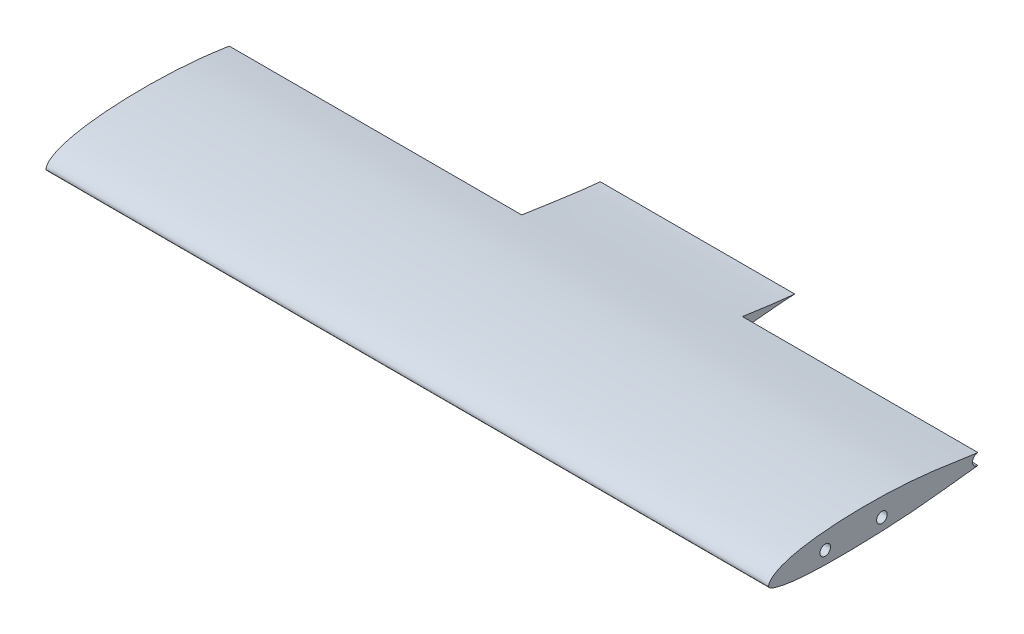
ISO-10303-21;
HEADER;
FILE_DESCRIPTION(('STEP AP214'),'2;1');
FILE_NAME('part.step','',(''),(''),'','','');
FILE_SCHEMA(('AUTOMOTIVE_DESIGN { 1 0 10303 214 1 1 1 1 }'));
ENDSEC;
DATA;
#1=APPLICATION_CONTEXT('core data for automotive mechanical design processes');
#2=APPLICATION_PROTOCOL_DEFINITION('international standard','automotive_design',2000,#1);
#3=PRODUCT_CONTEXT('',#1,'mechanical');
#4=PRODUCT('Part','Part','',(#3));
#5=PRODUCT_RELATED_PRODUCT_CATEGORY('part','',(#4));
#6=PRODUCT_DEFINITION_FORMATION('','',#4);
#7=PRODUCT_DEFINITION_CONTEXT('part definition',#1,'design');
#8=PRODUCT_DEFINITION('design','',#6,#7);
#9=PRODUCT_DEFINITION_SHAPE('','',#8);
#10=(LENGTH_UNIT() NAMED_UNIT(*) SI_UNIT(.MILLI.,.METRE.));
#11=(NAMED_UNIT(*) PLANE_ANGLE_UNIT() SI_UNIT($,.RADIAN.));
#12=(NAMED_UNIT(*) SI_UNIT($,.STERADIAN.) SOLID_ANGLE_UNIT());
#13=UNCERTAINTY_MEASURE_WITH_UNIT(LENGTH_MEASURE(1.E-05),#10,'distance_accuracy_value','');
#14=(GEOMETRIC_REPRESENTATION_CONTEXT(3) GLOBAL_UNCERTAINTY_ASSIGNED_CONTEXT((#13)) GLOBAL_UNIT_ASSIGNED_CONTEXT((#10,
#11,#12)) REPRESENTATION_CONTEXT('',''));
#15=CARTESIAN_POINT('',(0.,0.,0.));
#16=DIRECTION('',(0.,0.,1.));
#17=DIRECTION('',(1.,0.,0.));
#18=AXIS2_PLACEMENT_3D('',#15,#16,#17);
#19=CARTESIAN_POINT('',(1040.,4.83997638769715,-346.6));
#20=CARTESIAN_POINT('',(1040.,4.84868294691011,-346.59785213397));
#21=CARTESIAN_POINT('',(1040.,4.93336209756162,-345.166936044504));
#22=CARTESIAN_POINT('',(1040.,5.10700694519278,-343.709836643677));
#23=CARTESIAN_POINT('',(1040.,5.41017075794042,-340.206784132033));
#24=CARTESIAN_POINT('',(1040.,5.85268281466644,-335.905943355972));
#25=CARTESIAN_POINT('',(1040.,6.4722745474185,-330.29031907157));
#26=CARTESIAN_POINT('',(1040.,7.25373437050042,-323.655847310548));
#27=CARTESIAN_POINT('',(1040.,8.22307664941785,-315.997567636551));
#28=CARTESIAN_POINT('',(1040.,9.36156097861068,-307.423222857254));
#29=CARTESIAN_POINT('',(1040.,10.6635037599335,-298.010831034326));
#30=CARTESIAN_POINT('',(1040.,12.1173159709685,-287.854212759161));
#31=CARTESIAN_POINT('',(1040.,13.6988944275419,-277.048408585074));
#32=CARTESIAN_POINT('',(1040.,15.3817883153086,-265.691695949232));
#33=CARTESIAN_POINT('',(1040.,17.1219228948068,-253.881119893573));
#34=CARTESIAN_POINT('',(1040.,18.9007690967919,-241.720308010265));
#35=CARTESIAN_POINT('',(1040.,20.638143833598,-229.308493852932));
#36=CARTESIAN_POINT('',(1040.,22.3157910551663,-216.741551687001));
#37=CARTESIAN_POINT('',(1040.,23.7595433863055,-204.050857632811));
#38=CARTESIAN_POINT('',(1040.,24.9053426433323,-191.257428920763));
#39=CARTESIAN_POINT('',(1040.,25.8572517006955,-178.398255103325));
#40=CARTESIAN_POINT('',(1040.,26.5782085447624,-165.519761570319));
#41=CARTESIAN_POINT('',(1040.,27.0713380866151,-152.694536507981));
#42=CARTESIAN_POINT('',(1040.,27.3617048782736,-139.989981786491));
#43=CARTESIAN_POINT('',(1040.,27.4214259489243,-127.474648660722));
#44=CARTESIAN_POINT('',(1040.,27.2786662067202,-115.21693666225));
#45=CARTESIAN_POINT('',(1040.,26.9174034340255,-103.283909878835));
#46=CARTESIAN_POINT('',(1040.,26.360201212197,-91.7466650302918));
#47=CARTESIAN_POINT('',(1040.,25.602562122874,-80.6691840019192));
#48=CARTESIAN_POINT('',(1040.,24.6662261613144,-70.1181532773865));
#49=CARTESIAN_POINT('',(1040.,23.5415922869784,-60.1571368746462));
#50=CARTESIAN_POINT('',(1040.,22.2483852151924,-50.843546419187));
#51=CARTESIAN_POINT('',(1040.,20.7681558316871,-42.2316784452521));
#52=CARTESIAN_POINT('',(1040.,19.1388977835948,-34.3615830461008));
#53=CARTESIAN_POINT('',(1040.,17.3170359072766,-27.2684076187504));
#54=CARTESIAN_POINT('',(1040.,15.3019620529912,-20.9780333205586));
#55=CARTESIAN_POINT('',(1040.,13.1824606631904,-15.4779938036206));
#56=CARTESIAN_POINT('',(1040.,10.9371691606662,-10.7994149202204));
#57=CARTESIAN_POINT('',(1040.,8.63337766346878,-6.95382679368364));
#58=CARTESIAN_POINT('',(1040.,6.30098718992494,-3.93591898079676));
#59=CARTESIAN_POINT('',(1040.,3.89645227401003,-1.76621965553461));
#60=CARTESIAN_POINT('',(1040.,1.5610546807599,-0.467529411694256));
#61=CARTESIAN_POINT('',(1040.,-0.611861653624535,0.289663119257988));
#62=CARTESIAN_POINT('',(1040.,-2.77906348855156,-0.370650439303011));
#63=CARTESIAN_POINT('',(1040.,-4.21995184765395,-2.48232441391583));
#64=CARTESIAN_POINT('',(1040.,-5.67727699514903,-5.33698465791971));
#65=CARTESIAN_POINT('',(1040.,-7.07739123288437,-9.25198377943141));
#66=CARTESIAN_POINT('',(1040.,-8.39823430199488,-14.1065752398985));
#67=CARTESIAN_POINT('',(1040.,-9.61516954449393,-19.9024318244629));
#68=CARTESIAN_POINT('',(1040.,-10.7010995656754,-26.599345669982));
#69=CARTESIAN_POINT('',(1040.,-11.6537912755739,-34.1645195713889));
#70=CARTESIAN_POINT('',(1040.,-12.4597704216329,-42.5604388567903));
#71=CARTESIAN_POINT('',(1040.,-13.1153519549816,-51.7390191835686));
#72=CARTESIAN_POINT('',(1040.,-13.6251626516985,-61.6504552794448));
#73=CARTESIAN_POINT('',(1040.,-13.9816658713143,-72.2364850835678));
#74=CARTESIAN_POINT('',(1040.,-14.1886964665776,-83.4369290290459));
#75=CARTESIAN_POINT('',(1040.,-14.2450062649441,-95.1838047668361));
#76=CARTESIAN_POINT('',(1040.,-14.156607094396,-107.40667693573));
#77=CARTESIAN_POINT('',(1040.,-13.9277138872244,-120.030586221615));
#78=CARTESIAN_POINT('',(1040.,-13.5623258304755,-132.975867445929));
#79=CARTESIAN_POINT('',(1040.,-13.0683037139574,-146.159637367673));
#80=CARTESIAN_POINT('',(1040.,-12.4378717594453,-159.496107279272));
#81=CARTESIAN_POINT('',(1040.,-11.6818130666688,-172.896412867546));
#82=CARTESIAN_POINT('',(1040.,-10.7518834607499,-186.290828968544));
#83=CARTESIAN_POINT('',(1040.,-9.61892352332749,-199.629097752344));
#84=CARTESIAN_POINT('',(1040.,-8.33578917286104,-212.876622586146));
#85=CARTESIAN_POINT('',(1040.,-6.93958504172576,-225.984173770363));
#86=CARTESIAN_POINT('',(1040.,-5.47533275442785,-238.880374036266));
#87=CARTESIAN_POINT('',(1040.,-4.00845717439935,-251.491480033317));
#88=CARTESIAN_POINT('',(1040.,-2.58431265111658,-263.721696697937));
#89=CARTESIAN_POINT('',(1040.,-1.25971224140681,-275.470578158299));
#90=CARTESIAN_POINT('',(1040.,-0.0540326872204289,-286.627453872095));
#91=CARTESIAN_POINT('',(1040.,1.01236984619496,-297.086149346924));
#92=CARTESIAN_POINT('',(1040.,1.92639151980839,-306.747444526378));
#93=CARTESIAN_POINT('',(1040.,2.68985457896187,-315.513180102047));
#94=CARTESIAN_POINT('',(1040.,3.31662469525845,-323.304392995755));
#95=CARTESIAN_POINT('',(1040.,3.80488062569906,-330.019051028372));
#96=CARTESIAN_POINT('',(1040.,4.19871820912005,-335.688272924819));
#97=CARTESIAN_POINT('',(1040.,4.53103604311106,-340.041103550893));
#98=CARTESIAN_POINT('',(1040.,4.7368187688383,-343.623424741997));
#99=CARTESIAN_POINT('',(1040.,4.84931723782861,-345.114805989598));
#100=CARTESIAN_POINT('',(1040.,4.8310854484679,-346.602193351688));
#101=CARTESIAN_POINT('',(1040.,4.83997638769715,-346.6));
#102=B_SPLINE_CURVE_WITH_KNOTS('',3,(#19,#20,#21,#22,#23,#24,#25,#26,#27,#28,#29,#30,#31,#32,
#33,#34,#35,#36,#37,#38,#39,#40,#41,#42,#43,#44,#45,#46,#47,#48,#49,#50,#51,#52,#53,#54,#55,#56,
#57,#58,#59,#60,#61,#62,#63,#64,#65,#66,#67,#68,#69,#70,#71,#72,#73,#74,#75,#76,#77,#78,#79,#80,
#81,#82,#83,#84,#85,#86,#87,#88,#89,#90,#91,#92,#93,#94,#95,#96,#97,#98,#99,#100,#101),
.UNSPECIFIED.,.T.,.F.,(4,1,1,1,1,1,1,1,1,1,1,1,1,1,1,1,1,1,1,1,1,1,1,1,1,1,1,1,1,1,1,1,1,1,1,1,
1,1,1,1,1,1,1,1,1,1,1,1,1,1,1,1,1,1,1,1,1,1,1,1,1,1,1,1,1,1,1,1,1,1,1,1,1,1,1,1,1,1,1,1,4),(0.,
0.000971237958935089,0.00379550488941406,0.00838889713311412,0.0147108585341679,
0.0226780451151255,0.0321935893654122,0.0431578374772158,0.0554477635765267,0.0689450810748732,
0.0835209743295518,0.0990345049396833,0.115338149300278,0.132292378261073,0.149748787287016,
0.167548160817062,0.185533000847794,0.203606824322396,0.221802152219981,0.240094780419079,
0.258381325545334,0.276593840485898,0.294615696320151,0.312363136598153,0.329758285552068,
0.34668867666744,0.363076304230722,0.378823915995178,0.393853850968574,0.408070676422894,
0.421404123740081,0.433792847882556,0.445184773052429,0.455537591190034,0.464887425285465,
0.473229998593558,0.480557633281548,0.486906623799577,0.492238034051424,0.496718364977629,
0.500526341599145,0.503606091199367,0.506177592628953,0.509478573363382,0.514052138731787,
0.519911011985978,0.527046393100711,0.535434514860353,0.545049400456516,0.555862282514593,
0.56781964692456,0.58087606000333,0.594950040868561,0.609977749598367,0.625870112949949,
0.642537246695213,0.659878939874303,0.677794441934522,0.696172799529494,0.714892973853184,
0.733838964579521,0.752890035469179,0.771908418749841,0.790874705845988,0.809754599599678,
0.828447710464764,0.846871330730811,0.864890849052298,0.882382263972322,0.89917761398861,
0.915117479075331,0.930053399369896,0.943838005379903,0.956340240690094,0.967439356026097,
0.977019226998307,0.985009700423928,0.991382470548144,0.996091139759218,0.999008193999625,1.),.UNSPECIFIED.);
#103=DIRECTION('',(-1.,0.,0.));
#104=VECTOR('',#103,1.);
#105=SURFACE_OF_LINEAR_EXTRUSION('',#102,#104);
#106=CARTESIAN_POINT('',(1040.,13.6681639156747,-277.28));
#107=VERTEX_POINT('',#106);
#108=CARTESIAN_POINT('',(1040.,-1.06954068023385,-277.28));
#109=VERTEX_POINT('',#108);
#110=EDGE_CURVE('E114',#107,#109,#102,.T.);
#111=ORIENTED_EDGE('',*,*,#110,.F.);
#112=DIRECTION('',(1.,0.,0.));
#113=VECTOR('',#112,1.);
#114=CARTESIAN_POINT('',(728.,13.6681639156747,-277.28));
#115=LINE('',#114,#113);
#116=CARTESIAN_POINT('',(728.,13.6681639156747,-277.28));
#117=VERTEX_POINT('',#116);
#118=EDGE_CURVE('E72',#117,#107,#115,.T.);
#119=ORIENTED_EDGE('',*,*,#118,.F.);
#120=CARTESIAN_POINT('',(728.,4.83997638769715,-346.6));
#121=CARTESIAN_POINT('',(728.,4.84868294691011,-346.59785213397));
#122=CARTESIAN_POINT('',(728.,4.93336209756162,-345.166936044504));
#123=CARTESIAN_POINT('',(728.,5.10700694519278,-343.709836643677));
#124=CARTESIAN_POINT('',(728.,5.41017075794042,-340.206784132033));
#125=CARTESIAN_POINT('',(728.,5.85268281466644,-335.905943355972));
#126=CARTESIAN_POINT('',(728.,6.4722745474185,-330.29031907157));
#127=CARTESIAN_POINT('',(728.,7.25373437050042,-323.655847310548));
#128=CARTESIAN_POINT('',(728.,8.22307664941785,-315.997567636551));
#129=CARTESIAN_POINT('',(728.,9.36156097861068,-307.423222857254));
#130=CARTESIAN_POINT('',(728.,10.6635037599335,-298.010831034326));
#131=CARTESIAN_POINT('',(728.,12.1173159709685,-287.854212759161));
#132=CARTESIAN_POINT('',(728.,13.6988944275419,-277.048408585074));
#133=CARTESIAN_POINT('',(728.,15.3817883153086,-265.691695949232));
#134=CARTESIAN_POINT('',(728.,17.1219228948068,-253.881119893573));
#135=CARTESIAN_POINT('',(728.,18.9007690967919,-241.720308010265));
#136=CARTESIAN_POINT('',(728.,20.638143833598,-229.308493852932));
#137=CARTESIAN_POINT('',(728.,22.3157910551663,-216.741551687001));
#138=CARTESIAN_POINT('',(728.,23.7595433863055,-204.050857632811));
#139=CARTESIAN_POINT('',(728.,24.9053426433323,-191.257428920763));
#140=CARTESIAN_POINT('',(728.,25.8572517006955,-178.398255103325));
#141=CARTESIAN_POINT('',(728.,26.5782085447624,-165.519761570319));
#142=CARTESIAN_POINT('',(728.,27.0713380866151,-152.694536507981));
#143=CARTESIAN_POINT('',(728.,27.3617048782736,-139.989981786491));
#144=CARTESIAN_POINT('',(728.,27.4214259489243,-127.474648660722));
#145=CARTESIAN_POINT('',(728.,27.2786662067202,-115.21693666225));
#146=CARTESIAN_POINT('',(728.,26.9174034340255,-103.283909878835));
#147=CARTESIAN_POINT('',(728.,26.360201212197,-91.7466650302918));
#148=CARTESIAN_POINT('',(728.,25.602562122874,-80.6691840019192));
#149=CARTESIAN_POINT('',(728.,24.6662261613144,-70.1181532773865));
#150=CARTESIAN_POINT('',(728.,23.5415922869784,-60.1571368746462));
#151=CARTESIAN_POINT('',(728.,22.2483852151924,-50.843546419187));
#152=CARTESIAN_POINT('',(728.,20.7681558316871,-42.2316784452521));
#153=CARTESIAN_POINT('',(728.,19.1388977835948,-34.3615830461008));
#154=CARTESIAN_POINT('',(728.,17.3170359072766,-27.2684076187504));
#155=CARTESIAN_POINT('',(728.,15.3019620529912,-20.9780333205586));
#156=CARTESIAN_POINT('',(728.,13.1824606631904,-15.4779938036206));
#157=CARTESIAN_POINT('',(728.,10.9371691606662,-10.7994149202204));
#158=CARTESIAN_POINT('',(728.,8.63337766346878,-6.95382679368364));
#159=CARTESIAN_POINT('',(728.,6.30098718992494,-3.93591898079676));
#160=CARTESIAN_POINT('',(728.,3.89645227401003,-1.76621965553461));
#161=CARTESIAN_POINT('',(728.,1.5610546807599,-0.467529411694256));
#162=CARTESIAN_POINT('',(728.,-0.611861653624535,0.289663119257988));
#163=CARTESIAN_POINT('',(728.,-2.77906348855156,-0.370650439303011));
#164=CARTESIAN_POINT('',(728.,-4.21995184765395,-2.48232441391583));
#165=CARTESIAN_POINT('',(728.,-5.67727699514903,-5.33698465791971));
#166=CARTESIAN_POINT('',(728.,-7.07739123288437,-9.25198377943141));
#167=CARTESIAN_POINT('',(728.,-8.39823430199488,-14.1065752398985));
#168=CARTESIAN_POINT('',(728.,-9.61516954449393,-19.9024318244629));
#169=CARTESIAN_POINT('',(728.,-10.7010995656754,-26.599345669982));
#170=CARTESIAN_POINT('',(728.,-11.6537912755739,-34.1645195713889));
#171=CARTESIAN_POINT('',(728.,-12.4597704216329,-42.5604388567903));
#172=CARTESIAN_POINT('',(728.,-13.1153519549816,-51.7390191835686));
#173=CARTESIAN_POINT('',(728.,-13.6251626516985,-61.6504552794448));
#174=CARTESIAN_POINT('',(728.,-13.9816658713143,-72.2364850835678));
#175=CARTESIAN_POINT('',(728.,-14.1886964665776,-83.4369290290459));
#176=CARTESIAN_POINT('',(728.,-14.2450062649441,-95.1838047668361));
#177=CARTESIAN_POINT('',(728.,-14.156607094396,-107.40667693573));
#178=CARTESIAN_POINT('',(728.,-13.9277138872244,-120.030586221615));
#179=CARTESIAN_POINT('',(728.,-13.5623258304755,-132.975867445929));
#180=CARTESIAN_POINT('',(728.,-13.0683037139574,-146.159637367673));
#181=CARTESIAN_POINT('',(728.,-12.4378717594453,-159.496107279272));
#182=CARTESIAN_POINT('',(728.,-11.6818130666688,-172.896412867546));
#183=CARTESIAN_POINT('',(728.,-10.7518834607499,-186.290828968544));
#184=CARTESIAN_POINT('',(728.,-9.61892352332749,-199.629097752344));
#185=CARTESIAN_POINT('',(728.,-8.33578917286104,-212.876622586146));
#186=CARTESIAN_POINT('',(728.,-6.93958504172576,-225.984173770363));
#187=CARTESIAN_POINT('',(728.,-5.47533275442785,-238.880374036266));
#188=CARTESIAN_POINT('',(728.,-4.00845717439935,-251.491480033317));
#189=CARTESIAN_POINT('',(728.,-2.58431265111658,-263.721696697937));
#190=CARTESIAN_POINT('',(728.,-1.25971224140681,-275.470578158299));
#191=CARTESIAN_POINT('',(728.,-0.0540326872204289,-286.627453872095));
#192=CARTESIAN_POINT('',(728.,1.01236984619496,-297.086149346924));
#193=CARTESIAN_POINT('',(728.,1.92639151980839,-306.747444526378));
#194=CARTESIAN_POINT('',(728.,2.68985457896187,-315.513180102047));
#195=CARTESIAN_POINT('',(728.,3.31662469525845,-323.304392995755));
#196=CARTESIAN_POINT('',(728.,3.80488062569906,-330.019051028372));
#197=CARTESIAN_POINT('',(728.,4.19871820912005,-335.688272924819));
#198=CARTESIAN_POINT('',(728.,4.53103604311106,-340.041103550893));
#199=CARTESIAN_POINT('',(728.,4.7368187688383,-343.623424741997));
#200=CARTESIAN_POINT('',(728.,4.84931723782861,-345.114805989598));
#201=CARTESIAN_POINT('',(728.,4.8310854484679,-346.602193351688));
#202=CARTESIAN_POINT('',(728.,4.83997638769715,-346.6));
#203=B_SPLINE_CURVE_WITH_KNOTS('',3,(#120,#121,#122,#123,#124,#125,#126,#127,#128,#129,#130,
#131,#132,#133,#134,#135,#136,#137,#138,#139,#140,#141,#142,#143,#144,#145,#146,#147,#148,#149,
#150,#151,#152,#153,#154,#155,#156,#157,#158,#159,#160,#161,#162,#163,#164,#165,#166,#167,#168,
#169,#170,#171,#172,#173,#174,#175,#176,#177,#178,#179,#180,#181,#182,#183,#184,#185,#186,#187,
#188,#189,#190,#191,#192,#193,#194,#195,#196,#197,#198,#199,#200,#201,#202),.UNSPECIFIED.,.T.,
.F.,(4,1,1,1,1,1,1,1,1,1,1,1,1,1,1,1,1,1,1,1,1,1,1,1,1,1,1,1,1,1,1,1,1,1,1,1,1,1,1,1,1,1,1,1,1,
1,1,1,1,1,1,1,1,1,1,1,1,1,1,1,1,1,1,1,1,1,1,1,1,1,1,1,1,1,1,1,1,1,1,1,4),(0.,
0.000971237958935089,0.00379550488941406,0.00838889713311412,0.0147108585341679,
0.0226780451151255,0.0321935893654122,0.0431578374772158,0.0554477635765267,0.0689450810748732,
0.0835209743295518,0.0990345049396833,0.115338149300278,0.132292378261073,0.149748787287016,
0.167548160817062,0.185533000847794,0.203606824322396,0.221802152219981,0.240094780419079,
0.258381325545334,0.276593840485898,0.294615696320151,0.312363136598153,0.329758285552068,
0.34668867666744,0.363076304230722,0.378823915995178,0.393853850968574,0.408070676422894,
0.421404123740081,0.433792847882556,0.445184773052429,0.455537591190034,0.464887425285465,
0.473229998593558,0.480557633281548,0.486906623799577,0.492238034051424,0.496718364977629,
0.500526341599145,0.503606091199367,0.506177592628953,0.509478573363382,0.514052138731787,
0.519911011985978,0.527046393100711,0.535434514860353,0.545049400456516,0.555862282514593,
0.56781964692456,0.58087606000333,0.594950040868561,0.609977749598367,0.625870112949949,
0.642537246695213,0.659878939874303,0.677794441934522,0.696172799529494,0.714892973853184,
0.733838964579521,0.752890035469179,0.771908418749841,0.790874705845988,0.809754599599678,
0.828447710464764,0.846871330730811,0.864890849052298,0.882382263972322,0.89917761398861,
0.915117479075331,0.930053399369896,0.943838005379903,0.956340240690094,0.967439356026097,
0.977019226998307,0.985009700423928,0.991382470548144,0.996091139759218,0.999008193999625,1.),.UNSPECIFIED.);
#204=CARTESIAN_POINT('',(728.,-1.06954068023385,-277.28));
#205=VERTEX_POINT('',#204);
#206=EDGE_CURVE('E99',#205,#117,#203,.T.);
#207=ORIENTED_EDGE('',*,*,#206,.F.);
#208=DIRECTION('',(1.,0.,0.));
#209=VECTOR('',#208,1.);
#210=CARTESIAN_POINT('',(728.,-1.06954068023385,-277.28));
#211=LINE('',#210,#209);
#212=EDGE_CURVE('E108',#205,#109,#211,.T.);
#213=ORIENTED_EDGE('',*,*,#212,.T.);
#214=EDGE_LOOP('',(#111,#119,#207,#213));
#215=FACE_BOUND('',#214,.T.);
#216=DIRECTION('',(-1.,0.,0.));
#217=VECTOR('',#216,1.);
#218=CARTESIAN_POINT('',(470.4,-5.04057596839264,-242.599999999999));
#219=LINE('',#218,#217);
#220=CARTESIAN_POINT('',(470.4,-5.04057596839264,-242.599999999999));
#221=VERTEX_POINT('',#220);
#222=CARTESIAN_POINT('',(83.,-5.04057596839264,-242.599999999999));
#223=VERTEX_POINT('',#222);
#224=EDGE_CURVE('E80',#221,#223,#219,.T.);
#225=ORIENTED_EDGE('',*,*,#224,.F.);
#226=CARTESIAN_POINT('',(470.4,-5.04057596839266,-242.599999999999));
#227=CARTESIAN_POINT('',(470.4,-4.81790043899335,-244.526353052859));
#228=CARTESIAN_POINT('',(470.4,-4.59427289605636,-246.452595417754));
#229=CARTESIAN_POINT('',(470.4,-4.14633142404381,-250.30500113107));
#230=CARTESIAN_POINT('',(470.4,-3.92201749471503,-252.231164479462));
#231=CARTESIAN_POINT('',(470.4,-3.47392106538957,-256.083553025554));
#232=CARTESIAN_POINT('',(470.4,-3.25013856537292,-258.009778223252));
#233=CARTESIAN_POINT('',(470.4,-2.80490683127546,-261.862497915626));
#234=CARTESIAN_POINT('',(470.4,-2.58345759592163,-263.788992410155));
#235=CARTESIAN_POINT('',(470.4,-2.14420459647336,-267.642398271152));
#236=CARTESIAN_POINT('',(470.4,-1.92640083393848,-269.569309637798));
#237=CARTESIAN_POINT('',(470.4,-1.49484504001057,-273.423589792309));
#238=CARTESIAN_POINT('',(470.4,-1.28109301583488,-275.350958580982));
#239=CARTESIAN_POINT('',(470.4,-0.858298413683997,-279.206214134838));
#240=CARTESIAN_POINT('',(470.4,-0.649255837639434,-281.134100900233));
#241=CARTESIAN_POINT('',(470.4,-0.236797479228031,-284.990465843668));
#242=CARTESIAN_POINT('',(470.4,-0.0333816643499204,-286.918944018225));
#243=CARTESIAN_POINT('',(470.4,0.366911274099315,-290.776582318256));
#244=CARTESIAN_POINT('',(470.4,0.563788390131057,-292.705742444512));
#245=CARTESIAN_POINT('',(470.4,0.949916173595348,-296.564874247693));
#246=CARTESIAN_POINT('',(470.4,1.1391666560301,-298.494845943157));
#247=CARTESIAN_POINT('',(470.4,1.50928118213236,-302.355545231241));
#248=CARTESIAN_POINT('',(470.4,1.69014543718608,-304.286272803568));
#249=CARTESIAN_POINT('',(470.4,2.04286668323386,-308.148401672925));
#250=CARTESIAN_POINT('',(470.4,2.21472436413439,-310.079802906909));
#251=CARTESIAN_POINT('',(470.4,2.54962966984345,-313.943890506573));
#252=CARTESIAN_POINT('',(470.4,2.71267491748936,-315.876577078051));
#253=CARTESIAN_POINT('',(470.4,3.02930091814534,-319.742156556811));
#254=CARTESIAN_POINT('',(470.4,3.18288444790925,-321.675049235186));
#255=CARTESIAN_POINT('',(470.4,3.40422510612418,-324.574055791023));
#256=CARTESIAN_POINT('',(470.4,3.47646395870036,-325.539828452356));
#257=CARTESIAN_POINT('',(470.4,3.61874218090938,-327.472900785142));
#258=CARTESIAN_POINT('',(470.4,3.6887783149904,-328.440200694262));
#259=CARTESIAN_POINT('',(470.4,3.82725865428189,-330.378167195546));
#260=CARTESIAN_POINT('',(470.4,3.89569674776987,-331.348834221473));
#261=CARTESIAN_POINT('',(470.4,4.03237472487136,-333.286523268296));
#262=CARTESIAN_POINT('',(470.4,4.10061438881019,-334.253545301598));
#263=CARTESIAN_POINT('',(470.4,4.20515594972367,-335.698713114658));
#264=CARTESIAN_POINT('',(470.4,4.24017032806792,-336.176951562364));
#265=CARTESIAN_POINT('',(470.4,4.31057475831044,-337.132353523787));
#266=CARTESIAN_POINT('',(470.4,4.34596382635258,-337.609517110971));
#267=CARTESIAN_POINT('',(470.4,4.41609432315049,-338.570959856617));
#268=CARTESIAN_POINT('',(470.4,4.45081853390116,-339.055240296658));
#269=CARTESIAN_POINT('',(470.4,4.5185394758181,-340.03902844423));
#270=CARTESIAN_POINT('',(470.4,4.55144912208158,-340.538542181052));
#271=CARTESIAN_POINT('',(470.4,4.61467212622049,-341.539148549351));
#272=CARTESIAN_POINT('',(470.4,4.64497789584562,-342.040241658746));
#273=CARTESIAN_POINT('',(470.4,4.70397241795561,-342.997162295789));
#274=CARTESIAN_POINT('',(470.4,4.73256053505299,-343.452996786862));
#275=CARTESIAN_POINT('',(470.4,4.77673642599831,-344.116362682054));
#276=CARTESIAN_POINT('',(470.4,4.79092869998618,-344.323971432122));
#277=CARTESIAN_POINT('',(470.4,4.8149849405098,-344.769221980985));
#278=CARTESIAN_POINT('',(470.4,4.82394057947381,-345.006916045306));
#279=CARTESIAN_POINT('',(470.4,4.83254890713136,-345.389701495159));
#280=CARTESIAN_POINT('',(470.4,4.83446792964323,-345.53474119572));
#281=CARTESIAN_POINT('',(470.4,4.8362202889023,-345.846691282305));
#282=CARTESIAN_POINT('',(470.4,4.83569453649187,-346.013593838664));
#283=CARTESIAN_POINT('',(470.4,4.83477836541123,-346.256381765431));
#284=CARTESIAN_POINT('',(470.4,4.83447099901124,-346.332162665243));
#285=CARTESIAN_POINT('',(470.4,4.83456952308799,-346.437300272486));
#286=CARTESIAN_POINT('',(470.4,4.83465480472562,-346.46679218753));
#287=CARTESIAN_POINT('',(470.4,4.83520190821233,-346.518021972725));
#288=CARTESIAN_POINT('',(470.4,4.83555483401321,-346.539683723223));
#289=CARTESIAN_POINT('',(470.4,4.83638244571469,-346.568012928622));
#290=CARTESIAN_POINT('',(470.4,4.83661853034434,-346.57503571298));
#291=CARTESIAN_POINT('',(470.4,4.83733102942984,-346.585003225258));
#292=CARTESIAN_POINT('',(470.4,4.8375568317182,-346.587680464041));
#293=CARTESIAN_POINT('',(470.4,4.83785524258958,-346.591785083274));
#294=CARTESIAN_POINT('',(470.4,4.83795286932072,-346.593353962315));
#295=CARTESIAN_POINT('',(470.4,4.83875514363562,-346.597504767629));
#296=CARTESIAN_POINT('',(470.4,4.83935414418299,-346.599870023558));
#297=CARTESIAN_POINT('',(470.4,4.84063368741576,-346.600159588684));
#298=CARTESIAN_POINT('',(470.4,4.84131368702679,-346.597403069394));
#299=CARTESIAN_POINT('',(470.4,4.84324346607914,-346.588798650202));
#300=CARTESIAN_POINT('',(470.4,4.84360328283555,-346.585278608424));
#301=CARTESIAN_POINT('',(470.4,4.84476995328596,-346.574740704312));
#302=CARTESIAN_POINT('',(470.4,4.84571502121069,-346.566877765028));
#303=CARTESIAN_POINT('',(470.4,4.84908058449731,-346.536356279718));
#304=CARTESIAN_POINT('',(470.4,4.85073378673656,-346.515110102969));
#305=CARTESIAN_POINT('',(470.4,4.8572729831726,-346.429152306949));
#306=CARTESIAN_POINT('',(470.4,4.86200293562986,-346.362602818064));
#307=CARTESIAN_POINT('',(470.4,4.87210805990084,-346.213904872774));
#308=CARTESIAN_POINT('',(470.4,4.87734873352296,-346.132017878093));
#309=CARTESIAN_POINT('',(470.4,4.89325363382162,-345.889632507738));
#310=CARTESIAN_POINT('',(470.4,4.90431589552413,-345.728774337157));
#311=CARTESIAN_POINT('',(470.4,4.93566922032998,-345.310837282722));
#312=CARTESIAN_POINT('',(470.4,4.95751067685402,-345.054041819377));
#313=CARTESIAN_POINT('',(470.4,5.00268075443683,-344.585800542476));
#314=CARTESIAN_POINT('',(470.4,5.02507891106534,-344.374289321747));
#315=CARTESIAN_POINT('',(470.4,5.05839449848972,-344.058449442848));
#316=CARTESIAN_POINT('',(470.4,5.06937916918066,-343.954110375556));
#317=CARTESIAN_POINT('',(470.4,5.09134786647534,-343.740303926589));
#318=CARTESIAN_POINT('',(470.4,5.10230592286108,-343.630833723333));
#319=CARTESIAN_POINT('',(470.4,5.13600523407568,-343.28885148347));
#320=CARTESIAN_POINT('',(470.4,5.15815293241496,-343.056282380408));
#321=CARTESIAN_POINT('',(470.4,5.20285534236857,-342.578309502865));
#322=CARTESIAN_POINT('',(470.4,5.2253657201099,-342.33290160343));
#323=CARTESIAN_POINT('',(470.4,5.29371455941509,-341.583709942369));
#324=CARTESIAN_POINT('',(470.4,5.3391649176087,-341.079890314043));
#325=CARTESIAN_POINT('',(470.4,5.47689824353089,-339.605720748241));
#326=CARTESIAN_POINT('',(470.4,5.57354362518302,-338.635776634387));
#327=CARTESIAN_POINT('',(470.4,5.77212276224222,-336.711709411678));
#328=CARTESIAN_POINT('',(470.4,5.87395074932842,-335.757575106809));
#329=CARTESIAN_POINT('',(470.4,6.08221862691694,-333.837952125187));
#330=CARTESIAN_POINT('',(470.4,6.18869979990306,-332.872467920463));
#331=CARTESIAN_POINT('',(470.4,6.40530863459935,-330.940807368128));
#332=CARTESIAN_POINT('',(470.4,6.51544027130188,-329.974631467041));
#333=CARTESIAN_POINT('',(470.4,6.8500777010983,-327.083685346183));
#334=CARTESIAN_POINT('',(470.4,7.07958752750583,-325.159491374509));
#335=CARTESIAN_POINT('',(470.4,7.55196089855657,-321.311291073211));
#336=CARTESIAN_POINT('',(470.4,7.79483429429874,-319.387285958403));
#337=CARTESIAN_POINT('',(470.4,8.28941470880274,-315.540250889156));
#338=CARTESIAN_POINT('',(470.4,8.54112247659432,-313.617221031497));
#339=CARTESIAN_POINT('',(470.4,9.05184941609702,-309.772536842436));
#340=CARTESIAN_POINT('',(470.4,9.31086706888201,-307.850882309116));
#341=CARTESIAN_POINT('',(470.4,9.83534211744316,-304.00828267113));
#342=CARTESIAN_POINT('',(470.4,10.1008000727563,-302.087337642931));
#343=CARTESIAN_POINT('',(470.4,10.6373400002637,-298.246220729586));
#344=CARTESIAN_POINT('',(470.4,10.90842201053,-296.326048849765));
#345=CARTESIAN_POINT('',(470.4,11.4551655050206,-292.486398937231));
#346=CARTESIAN_POINT('',(470.4,11.7308268937594,-290.566920890903));
#347=CARTESIAN_POINT('',(470.4,12.28556463337,-286.728452922536));
#348=CARTESIAN_POINT('',(470.4,12.5646409947528,-284.809463002019));
#349=CARTESIAN_POINT('',(470.4,13.1253705109116,-280.9718516625));
#350=CARTESIAN_POINT('',(470.4,13.4070236766433,-279.0532302451));
#351=CARTESIAN_POINT('',(470.4,13.9720850174958,-275.216249016253));
#352=CARTESIAN_POINT('',(470.4,14.2554931900897,-273.297889204433));
#353=CARTESIAN_POINT('',(470.4,14.8227563629235,-269.461238122766));
#354=CARTESIAN_POINT('',(470.4,15.1066113626237,-267.542946852838));
#355=CARTESIAN_POINT('',(470.4,15.6735101339023,-263.70624408976));
#356=CARTESIAN_POINT('',(470.4,15.956553905387,-261.787832596597));
#357=CARTESIAN_POINT('',(470.4,16.5217698813349,-257.950879310199));
#358=CARTESIAN_POINT('',(470.4,16.8039420848592,-256.032337516827));
#359=CARTESIAN_POINT('',(470.4,17.3673556403513,-252.195114588928));
#360=CARTESIAN_POINT('',(470.4,17.648596991396,-250.276433454266));
#361=CARTESIAN_POINT('',(470.4,18.2080068766833,-246.438627718452));
#362=CARTESIAN_POINT('',(470.4,18.4861754169665,-244.519503118179));
#363=CARTESIAN_POINT('',(470.4,18.7617372690907,-242.6));
#364=B_SPLINE_CURVE_WITH_KNOTS('',3,(#226,#227,#228,#229,#230,#231,#232,#233,#234,#235,#236,
#237,#238,#239,#240,#241,#242,#243,#244,#245,#246,#247,#248,#249,#250,#251,#252,#253,#254,#255,
#256,#257,#258,#259,#260,#261,#262,#263,#264,#265,#266,#267,#268,#269,#270,#271,#272,#273,#274,
#275,#276,#277,#278,#279,#280,#281,#282,#283,#284,#285,#286,#287,#288,#289,#290,#291,#292,#293,
#294,#295,#296,#297,#298,#299,#300,#301,#302,#303,#304,#305,#306,#307,#308,#309,#310,#311,#312,
#313,#314,#315,#316,#317,#318,#319,#320,#321,#322,#323,#324,#325,#326,#327,#328,#329,#330,#331,
#332,#333,#334,#335,#336,#337,#338,#339,#340,#341,#342,#343,#344,#345,#346,#347,#348,#349,#350,
#351,#352,#353,#354,#355,#356,#357,#358,#359,#360,#361,#362,#363),.UNSPECIFIED.,.F.,.F.,(4,2,2,
2,2,2,2,2,2,2,2,2,2,2,2,2,2,2,2,2,2,2,2,2,2,2,2,2,2,2,2,2,2,2,2,2,2,2,2,2,2,2,2,2,2,2,2,2,2,2,2,
2,2,2,2,2,2,2,2,2,2,2,2,2,2,2,2,2,4),(0.,5.81754005676483,11.6350822600256,17.452624244771,
23.2701630553534,29.0877043546572,34.9052560157586,40.722810061723,46.5403304869955,
52.3578576198704,58.1755257825531,63.9930472232239,69.8101223865759,75.6287589595191,
81.4456797073611,84.3510879736333,87.2605815758041,90.1798117891275,93.0880897856735,
94.5266445397861,95.9620673691829,97.418633815223,98.920415008844,100.426433928012,
101.796640698695,102.420892724062,103.134350392384,103.569456105587,104.070327255263,
104.297483995203,104.386146834366,104.45065824166,104.472099786817,104.479814758982,
104.485417030796,104.490070136223,104.495386276515,104.509406383687,104.531546525956,
104.59736345243,104.794985695329,105.042034292416,105.525112984012,106.298571382986,
106.936563131937,107.251316790949,107.581365581107,108.282228007129,109.021541988716,
110.539134496275,113.463316464476,116.341969238528,119.25597706098,122.173269521488,
127.986715084238,133.804505051276,139.622789481862,145.439873701672,151.257465135664,
157.075095964665,162.89260564116,168.710133228114,174.527685560586,180.345229518636,
186.162766454765,191.980304062536,197.79784793462,203.615397574539,209.432935776403),.UNSPECIFIED.);
#365=CARTESIAN_POINT('',(470.4,18.7617372690907,-242.6));
#366=VERTEX_POINT('',#365);
#367=EDGE_CURVE('E124',#221,#366,#364,.T.);
#368=ORIENTED_EDGE('',*,*,#367,.T.);
#369=DIRECTION('',(-1.,0.,0.));
#370=VECTOR('',#369,1.);
#371=CARTESIAN_POINT('',(470.4,18.7617372690907,-242.6));
#372=LINE('',#371,#370);
#373=CARTESIAN_POINT('',(83.,18.7617372690907,-242.6));
#374=VERTEX_POINT('',#373);
#375=EDGE_CURVE('E172',#366,#374,#372,.T.);
#376=ORIENTED_EDGE('',*,*,#375,.T.);
#377=CARTESIAN_POINT('',(83.,4.83997638769715,-346.6));
#378=CARTESIAN_POINT('',(83.,4.84868294691011,-346.59785213397));
#379=CARTESIAN_POINT('',(83.,4.93336209756162,-345.166936044504));
#380=CARTESIAN_POINT('',(83.,5.10700694519278,-343.709836643677));
#381=CARTESIAN_POINT('',(83.,5.41017075794042,-340.206784132033));
#382=CARTESIAN_POINT('',(83.,5.85268281466644,-335.905943355972));
#383=CARTESIAN_POINT('',(83.,6.4722745474185,-330.29031907157));
#384=CARTESIAN_POINT('',(83.,7.25373437050042,-323.655847310548));
#385=CARTESIAN_POINT('',(83.,8.22307664941785,-315.997567636551));
#386=CARTESIAN_POINT('',(83.,9.36156097861068,-307.423222857254));
#387=CARTESIAN_POINT('',(83.,10.6635037599335,-298.010831034326));
#388=CARTESIAN_POINT('',(83.,12.1173159709685,-287.854212759161));
#389=CARTESIAN_POINT('',(83.,13.6988944275419,-277.048408585074));
#390=CARTESIAN_POINT('',(83.,15.3817883153086,-265.691695949232));
#391=CARTESIAN_POINT('',(83.,17.1219228948068,-253.881119893573));
#392=CARTESIAN_POINT('',(83.,18.9007690967919,-241.720308010265));
#393=CARTESIAN_POINT('',(83.,20.638143833598,-229.308493852932));
#394=CARTESIAN_POINT('',(83.,22.3157910551663,-216.741551687001));
#395=CARTESIAN_POINT('',(83.,23.7595433863055,-204.050857632811));
#396=CARTESIAN_POINT('',(83.,24.9053426433323,-191.257428920763));
#397=CARTESIAN_POINT('',(83.,25.8572517006955,-178.398255103325));
#398=CARTESIAN_POINT('',(83.,26.5782085447624,-165.519761570319));
#399=CARTESIAN_POINT('',(83.,27.0713380866151,-152.694536507981));
#400=CARTESIAN_POINT('',(83.,27.3617048782736,-139.989981786491));
#401=CARTESIAN_POINT('',(83.,27.4214259489243,-127.474648660722));
#402=CARTESIAN_POINT('',(83.,27.2786662067202,-115.21693666225));
#403=CARTESIAN_POINT('',(83.,26.9174034340255,-103.283909878835));
#404=CARTESIAN_POINT('',(83.,26.360201212197,-91.7466650302918));
#405=CARTESIAN_POINT('',(83.,25.602562122874,-80.6691840019192));
#406=CARTESIAN_POINT('',(83.,24.6662261613144,-70.1181532773865));
#407=CARTESIAN_POINT('',(83.,23.5415922869784,-60.1571368746462));
#408=CARTESIAN_POINT('',(83.,22.2483852151924,-50.843546419187));
#409=CARTESIAN_POINT('',(83.,20.7681558316871,-42.2316784452521));
#410=CARTESIAN_POINT('',(83.,19.1388977835948,-34.3615830461008));
#411=CARTESIAN_POINT('',(83.,17.3170359072766,-27.2684076187504));
#412=CARTESIAN_POINT('',(83.,15.3019620529912,-20.9780333205586));
#413=CARTESIAN_POINT('',(83.,13.1824606631904,-15.4779938036206));
#414=CARTESIAN_POINT('',(83.,10.9371691606662,-10.7994149202204));
#415=CARTESIAN_POINT('',(83.,8.63337766346878,-6.95382679368364));
#416=CARTESIAN_POINT('',(83.,6.30098718992494,-3.93591898079676));
#417=CARTESIAN_POINT('',(83.,3.89645227401003,-1.76621965553461));
#418=CARTESIAN_POINT('',(83.,1.5610546807599,-0.467529411694256));
#419=CARTESIAN_POINT('',(83.,-0.611861653624535,0.289663119257988));
#420=CARTESIAN_POINT('',(83.,-2.77906348855156,-0.370650439303011));
#421=CARTESIAN_POINT('',(83.,-4.21995184765395,-2.48232441391583));
#422=CARTESIAN_POINT('',(83.,-5.67727699514903,-5.33698465791971));
#423=CARTESIAN_POINT('',(83.,-7.07739123288437,-9.25198377943141));
#424=CARTESIAN_POINT('',(83.,-8.39823430199488,-14.1065752398985));
#425=CARTESIAN_POINT('',(83.,-9.61516954449393,-19.9024318244629));
#426=CARTESIAN_POINT('',(83.,-10.7010995656754,-26.599345669982));
#427=CARTESIAN_POINT('',(83.,-11.6537912755739,-34.1645195713889));
#428=CARTESIAN_POINT('',(83.,-12.4597704216329,-42.5604388567903));
#429=CARTESIAN_POINT('',(83.,-13.1153519549816,-51.7390191835686));
#430=CARTESIAN_POINT('',(83.,-13.6251626516985,-61.6504552794448));
#431=CARTESIAN_POINT('',(83.,-13.9816658713143,-72.2364850835678));
#432=CARTESIAN_POINT('',(83.,-14.1886964665776,-83.4369290290459));
#433=CARTESIAN_POINT('',(83.,-14.2450062649441,-95.1838047668361));
#434=CARTESIAN_POINT('',(83.,-14.156607094396,-107.40667693573));
#435=CARTESIAN_POINT('',(83.,-13.9277138872244,-120.030586221615));
#436=CARTESIAN_POINT('',(83.,-13.5623258304755,-132.975867445929));
#437=CARTESIAN_POINT('',(83.,-13.0683037139574,-146.159637367673));
#438=CARTESIAN_POINT('',(83.,-12.4378717594453,-159.496107279272));
#439=CARTESIAN_POINT('',(83.,-11.6818130666688,-172.896412867546));
#440=CARTESIAN_POINT('',(83.,-10.7518834607499,-186.290828968544));
#441=CARTESIAN_POINT('',(83.,-9.61892352332749,-199.629097752344));
#442=CARTESIAN_POINT('',(83.,-8.33578917286104,-212.876622586146));
#443=CARTESIAN_POINT('',(83.,-6.93958504172576,-225.984173770363));
#444=CARTESIAN_POINT('',(83.,-5.47533275442785,-238.880374036266));
#445=CARTESIAN_POINT('',(83.,-4.00845717439935,-251.491480033317));
#446=CARTESIAN_POINT('',(83.,-2.58431265111658,-263.721696697937));
#447=CARTESIAN_POINT('',(83.,-1.25971224140681,-275.470578158299));
#448=CARTESIAN_POINT('',(83.,-0.0540326872204289,-286.627453872095));
#449=CARTESIAN_POINT('',(83.,1.01236984619496,-297.086149346924));
#450=CARTESIAN_POINT('',(83.,1.92639151980839,-306.747444526378));
#451=CARTESIAN_POINT('',(83.,2.68985457896187,-315.513180102047));
#452=CARTESIAN_POINT('',(83.,3.31662469525845,-323.304392995755));
#453=CARTESIAN_POINT('',(83.,3.80488062569906,-330.019051028372));
#454=CARTESIAN_POINT('',(83.,4.19871820912005,-335.688272924819));
#455=CARTESIAN_POINT('',(83.,4.53103604311106,-340.041103550893));
#456=CARTESIAN_POINT('',(83.,4.7368187688383,-343.623424741997));
#457=CARTESIAN_POINT('',(83.,4.84931723782861,-345.114805989598));
#458=CARTESIAN_POINT('',(83.,4.8310854484679,-346.602193351688));
#459=CARTESIAN_POINT('',(83.,4.83997638769715,-346.6));
#460=B_SPLINE_CURVE_WITH_KNOTS('',3,(#377,#378,#379,#380,#381,#382,#383,#384,#385,#386,#387,
#388,#389,#390,#391,#392,#393,#394,#395,#396,#397,#398,#399,#400,#401,#402,#403,#404,#405,#406,
#407,#408,#409,#410,#411,#412,#413,#414,#415,#416,#417,#418,#419,#420,#421,#422,#423,#424,#425,
#426,#427,#428,#429,#430,#431,#432,#433,#434,#435,#436,#437,#438,#439,#440,#441,#442,#443,#444,
#445,#446,#447,#448,#449,#450,#451,#452,#453,#454,#455,#456,#457,#458,#459),.UNSPECIFIED.,.T.,
.F.,(4,1,1,1,1,1,1,1,1,1,1,1,1,1,1,1,1,1,1,1,1,1,1,1,1,1,1,1,1,1,1,1,1,1,1,1,1,1,1,1,1,1,1,1,1,
1,1,1,1,1,1,1,1,1,1,1,1,1,1,1,1,1,1,1,1,1,1,1,1,1,1,1,1,1,1,1,1,1,1,1,4),(0.,
0.000971237958935089,0.00379550488941406,0.00838889713311412,0.0147108585341679,
0.0226780451151255,0.0321935893654122,0.0431578374772158,0.0554477635765267,0.0689450810748732,
0.0835209743295518,0.0990345049396833,0.115338149300278,0.132292378261073,0.149748787287016,
0.167548160817062,0.185533000847794,0.203606824322396,0.221802152219981,0.240094780419079,
0.258381325545334,0.276593840485898,0.294615696320151,0.312363136598153,0.329758285552068,
0.34668867666744,0.363076304230722,0.378823915995178,0.393853850968574,0.408070676422894,
0.421404123740081,0.433792847882556,0.445184773052429,0.455537591190034,0.464887425285465,
0.473229998593558,0.480557633281548,0.486906623799577,0.492238034051424,0.496718364977629,
0.500526341599145,0.503606091199367,0.506177592628953,0.509478573363382,0.514052138731787,
0.519911011985978,0.527046393100711,0.535434514860353,0.545049400456516,0.555862282514593,
0.56781964692456,0.58087606000333,0.594950040868561,0.609977749598367,0.625870112949949,
0.642537246695213,0.659878939874303,0.677794441934522,0.696172799529494,0.714892973853184,
0.733838964579521,0.752890035469179,0.771908418749841,0.790874705845988,0.809754599599678,
0.828447710464764,0.846871330730811,0.864890849052298,0.882382263972322,0.89917761398861,
0.915117479075331,0.930053399369896,0.943838005379903,0.956340240690094,0.967439356026097,
0.977019226998307,0.985009700423928,0.991382470548144,0.996091139759218,0.999008193999625,1.),.UNSPECIFIED.);
#461=EDGE_CURVE('E179',#374,#223,#460,.T.);
#462=ORIENTED_EDGE('',*,*,#461,.T.);
#463=EDGE_LOOP('',(#225,#368,#376,#462));
#464=FACE_BOUND('',#463,.T.);
#465=ADVANCED_FACE('F52',(#215,#464),#105,.F.);
#466=CARTESIAN_POINT('',(1040.,3.,-75.));
#467=DIRECTION('',(-1.,0.,0.));
#468=DIRECTION('',(0.,0.,1.));
#469=AXIS2_PLACEMENT_3D('',#466,#467,#468);
#470=CYLINDRICAL_SURFACE('',#469,7.);
#471=CARTESIAN_POINT('',(83.,3.,-75.));
#472=DIRECTION('',(1.,0.,0.));
#473=DIRECTION('',(0.,0.,-1.));
#474=AXIS2_PLACEMENT_3D('',#471,#472,#473);
#475=CIRCLE('',#474,7.);
#476=CARTESIAN_POINT('',(83.,3.,-82.));
#477=VERTEX_POINT('',#476);
#478=EDGE_CURVE('E13',#477,#477,#475,.T.);
#479=ORIENTED_EDGE('',*,*,#478,.F.);
#480=EDGE_LOOP('',(#479));
#481=FACE_BOUND('',#480,.T.);
#482=CARTESIAN_POINT('',(1040.,3.,-75.));
#483=DIRECTION('',(1.,0.,0.));
#484=DIRECTION('',(0.,0.,-1.));
#485=AXIS2_PLACEMENT_3D('',#482,#483,#484);
#486=CIRCLE('',#485,7.);
#487=CARTESIAN_POINT('',(1040.,3.,-82.));
#488=VERTEX_POINT('',#487);
#489=EDGE_CURVE('E190',#488,#488,#486,.T.);
#490=ORIENTED_EDGE('',*,*,#489,.T.);
#491=EDGE_LOOP('',(#490));
#492=FACE_BOUND('',#491,.T.);
#493=ADVANCED_FACE('F159',(#481,#492),#470,.F.);
#494=CARTESIAN_POINT('',(1040.,3.,-150.));
#495=DIRECTION('',(-1.,0.,0.));
#496=DIRECTION('',(0.,0.,1.));
#497=AXIS2_PLACEMENT_3D('',#494,#495,#496);
#498=CYLINDRICAL_SURFACE('',#497,7.00000000000001);
#499=CARTESIAN_POINT('',(83.,3.,-150.));
#500=DIRECTION('',(1.,0.,0.));
#501=DIRECTION('',(0.,0.,-1.));
#502=AXIS2_PLACEMENT_3D('',#499,#500,#501);
#503=CIRCLE('',#502,7.00000000000001);
#504=CARTESIAN_POINT('',(83.,3.,-157.));
#505=VERTEX_POINT('',#504);
#506=EDGE_CURVE('E64',#505,#505,#503,.T.);
#507=ORIENTED_EDGE('',*,*,#506,.F.);
#508=EDGE_LOOP('',(#507));
#509=FACE_BOUND('',#508,.T.);
#510=CARTESIAN_POINT('',(1040.,3.,-150.));
#511=DIRECTION('',(1.,0.,0.));
#512=DIRECTION('',(0.,0.,-1.));
#513=AXIS2_PLACEMENT_3D('',#510,#511,#512);
#514=CIRCLE('',#513,7.00000000000001);
#515=CARTESIAN_POINT('',(1040.,3.,-157.));
#516=VERTEX_POINT('',#515);
#517=EDGE_CURVE('E164',#516,#516,#514,.T.);
#518=ORIENTED_EDGE('',*,*,#517,.T.);
#519=EDGE_LOOP('',(#518));
#520=FACE_BOUND('',#519,.T.);
#521=ADVANCED_FACE('F54',(#509,#520),#498,.F.);
#522=CARTESIAN_POINT('',(1040.,1.70299127438189,-0.611004109820096));
#523=DIRECTION('',(-1.,0.,0.));
#524=DIRECTION('',(0.,0.,1.));
#525=AXIS2_PLACEMENT_3D('',#522,#523,#524);
#526=PLANE('',#525);
#527=ORIENTED_EDGE('',*,*,#110,.T.);
#528=CARTESIAN_POINT('',(1040.,6.2993116177204,-277.28));
#529=DIRECTION('',(1.,0.,0.));
#530=DIRECTION('',(0.,0.,-1.));
#531=AXIS2_PLACEMENT_3D('',#528,#529,#530);
#532=CIRCLE('',#531,7.36885229795428);
#533=EDGE_CURVE('E105',#107,#109,#532,.T.);
#534=ORIENTED_EDGE('',*,*,#533,.F.);
#535=EDGE_LOOP('',(#527,#534));
#536=FACE_BOUND('',#535,.T.);
#537=ORIENTED_EDGE('',*,*,#489,.F.);
#538=EDGE_LOOP('',(#537));
#539=FACE_BOUND('',#538,.T.);
#540=ORIENTED_EDGE('',*,*,#517,.F.);
#541=EDGE_LOOP('',(#540));
#542=FACE_BOUND('',#541,.T.);
#543=ADVANCED_FACE('F150',(#536,#539,#542),#526,.F.);
#544=CARTESIAN_POINT('',(83.,-14.2450062649441,-386.283521712668));
#545=DIRECTION('',(1.,0.,0.));
#546=DIRECTION('',(0.,0.,-1.));
#547=AXIS2_PLACEMENT_3D('',#544,#545,#546);
#548=PLANE('',#547);
#549=CARTESIAN_POINT('',(83.,6.86058065034906,-242.6));
#550=DIRECTION('',(1.,0.,0.));
#551=DIRECTION('',(0.,0.,-1.));
#552=AXIS2_PLACEMENT_3D('',#549,#550,#551);
#553=CIRCLE('',#552,11.9011566187417);
#554=EDGE_CURVE('E118',#374,#223,#553,.T.);
#555=ORIENTED_EDGE('',*,*,#554,.T.);
#556=ORIENTED_EDGE('',*,*,#461,.F.);
#557=EDGE_LOOP('',(#555,#556));
#558=FACE_BOUND('',#557,.T.);
#559=ORIENTED_EDGE('',*,*,#506,.T.);
#560=EDGE_LOOP('',(#559));
#561=FACE_BOUND('',#560,.T.);
#562=ORIENTED_EDGE('',*,*,#478,.T.);
#563=EDGE_LOOP('',(#562));
#564=FACE_BOUND('',#563,.T.);
#565=ADVANCED_FACE('F149',(#558,#561,#564),#548,.F.);
#566=CARTESIAN_POINT('',(470.4,6.86058065034906,-242.6));
#567=DIRECTION('',(-1.,0.,0.));
#568=DIRECTION('',(0.,0.,1.));
#569=AXIS2_PLACEMENT_3D('',#566,#567,#568);
#570=CYLINDRICAL_SURFACE('',#569,11.9011566187417);
#571=ORIENTED_EDGE('',*,*,#554,.F.);
#572=ORIENTED_EDGE('',*,*,#375,.F.);
#573=CARTESIAN_POINT('',(470.4,6.86058065034906,-242.6));
#574=DIRECTION('',(1.,0.,0.));
#575=DIRECTION('',(0.,0.,-1.));
#576=AXIS2_PLACEMENT_3D('',#573,#574,#575);
#577=CIRCLE('',#576,11.9011566187417);
#578=EDGE_CURVE('E133',#366,#221,#577,.T.);
#579=ORIENTED_EDGE('',*,*,#578,.T.);
#580=ORIENTED_EDGE('',*,*,#224,.T.);
#581=EDGE_LOOP('',(#571,#572,#579,#580));
#582=FACE_BOUND('',#581,.T.);
#583=ADVANCED_FACE('F145',(#582),#570,.F.);
#584=CARTESIAN_POINT('',(470.4,4.85236752181112,-346.493634640705));
#585=DIRECTION('',(-1.,0.,0.));
#586=DIRECTION('',(0.,0.,1.));
#587=AXIS2_PLACEMENT_3D('',#584,#585,#586);
#588=PLANE('',#587);
#589=ORIENTED_EDGE('',*,*,#367,.F.);
#590=ORIENTED_EDGE('',*,*,#578,.F.);
#591=EDGE_LOOP('',(#589,#590));
#592=FACE_BOUND('',#591,.T.);
#593=ADVANCED_FACE('F135',(#592),#588,.T.);
#594=CARTESIAN_POINT('',(728.,6.2993116177204,-277.28));
#595=DIRECTION('',(1.,0.,0.));
#596=DIRECTION('',(0.,0.,-1.));
#597=AXIS2_PLACEMENT_3D('',#594,#595,#596);
#598=CYLINDRICAL_SURFACE('',#597,7.36885229795428);
#599=ORIENTED_EDGE('',*,*,#533,.T.);
#600=ORIENTED_EDGE('',*,*,#212,.F.);
#601=CARTESIAN_POINT('',(728.,6.2993116177204,-277.28));
#602=DIRECTION('',(1.,0.,0.));
#603=DIRECTION('',(0.,0.,-1.));
#604=AXIS2_PLACEMENT_3D('',#601,#602,#603);
#605=CIRCLE('',#604,7.36885229795428);
#606=EDGE_CURVE('E101',#117,#205,#605,.T.);
#607=ORIENTED_EDGE('',*,*,#606,.F.);
#608=ORIENTED_EDGE('',*,*,#118,.T.);
#609=EDGE_LOOP('',(#599,#600,#607,#608));
#610=FACE_BOUND('',#609,.T.);
#611=ADVANCED_FACE('F107',(#610),#598,.F.);
#612=CARTESIAN_POINT('',(728.,0.,0.));
#613=DIRECTION('',(1.,0.,0.));
#614=DIRECTION('',(0.,0.,-1.));
#615=AXIS2_PLACEMENT_3D('',#612,#613,#614);
#616=PLANE('',#615);
#617=ORIENTED_EDGE('',*,*,#206,.T.);
#618=ORIENTED_EDGE('',*,*,#606,.T.);
#619=EDGE_LOOP('',(#617,#618));
#620=FACE_BOUND('',#619,.T.);
#621=ADVANCED_FACE('F100',(#620),#616,.T.);
#622=CLOSED_SHELL('',(#465,#493,#521,#543,#565,#583,#593,#611,#621));
#623=MANIFOLD_SOLID_BREP('B2',#622);
#624=ADVANCED_BREP_SHAPE_REPRESENTATION('',(#18,#623),#14);
#625=SHAPE_DEFINITION_REPRESENTATION(#9,#624);
ENDSEC;
END-ISO-10303-21;
